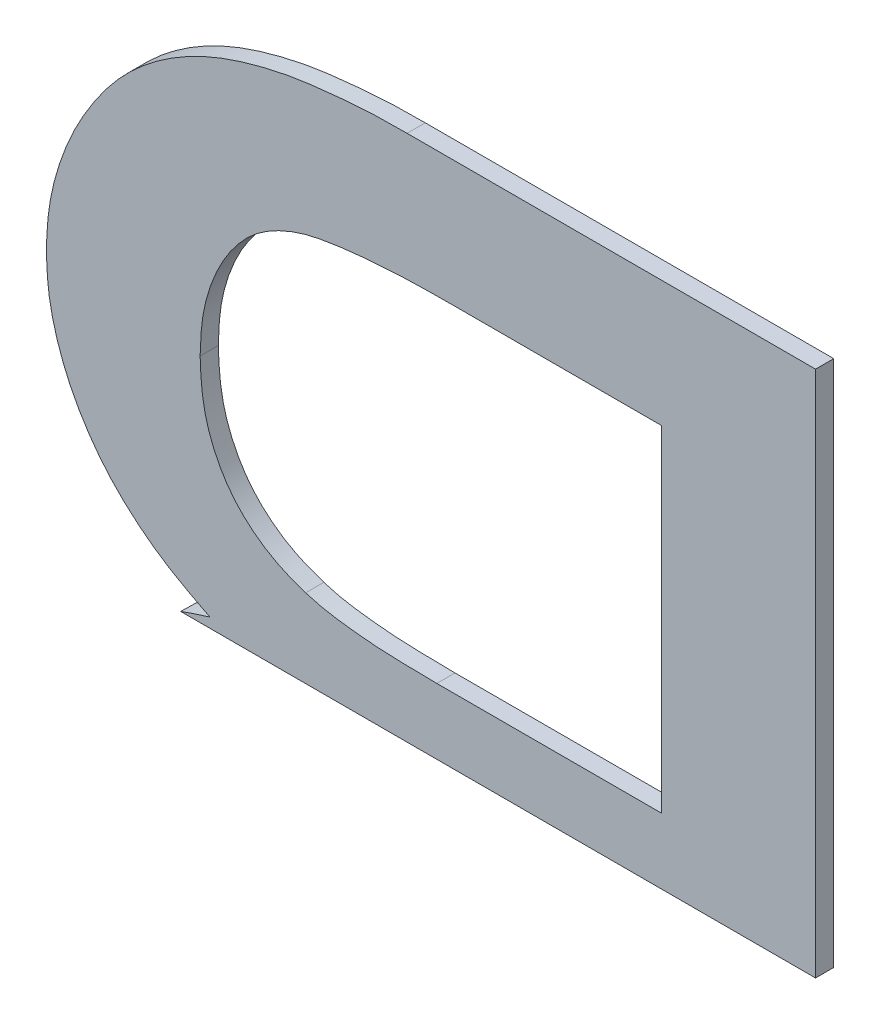
ISO-10303-21;
HEADER;
FILE_DESCRIPTION(('STEP AP214'),'2;1');
FILE_NAME('part.step','',(''),(''),'','','');
FILE_SCHEMA(('AUTOMOTIVE_DESIGN { 1 0 10303 214 1 1 1 1 }'));
ENDSEC;
DATA;
#1=APPLICATION_CONTEXT('core data for automotive mechanical design processes');
#2=APPLICATION_PROTOCOL_DEFINITION('international standard','automotive_design',2000,#1);
#3=PRODUCT_CONTEXT('',#1,'mechanical');
#4=PRODUCT('Part','Part','',(#3));
#5=PRODUCT_RELATED_PRODUCT_CATEGORY('part','',(#4));
#6=PRODUCT_DEFINITION_FORMATION('','',#4);
#7=PRODUCT_DEFINITION_CONTEXT('part definition',#1,'design');
#8=PRODUCT_DEFINITION('design','',#6,#7);
#9=PRODUCT_DEFINITION_SHAPE('','',#8);
#10=(LENGTH_UNIT() NAMED_UNIT(*) SI_UNIT(.MILLI.,.METRE.));
#11=(NAMED_UNIT(*) PLANE_ANGLE_UNIT() SI_UNIT($,.RADIAN.));
#12=(NAMED_UNIT(*) SI_UNIT($,.STERADIAN.) SOLID_ANGLE_UNIT());
#13=UNCERTAINTY_MEASURE_WITH_UNIT(LENGTH_MEASURE(1.E-05),#10,'distance_accuracy_value','');
#14=(GEOMETRIC_REPRESENTATION_CONTEXT(3) GLOBAL_UNCERTAINTY_ASSIGNED_CONTEXT((#13)) GLOBAL_UNIT_ASSIGNED_CONTEXT((#10,
#11,#12)) REPRESENTATION_CONTEXT('',''));
#15=CARTESIAN_POINT('',(0.,0.,0.));
#16=DIRECTION('',(0.,0.,1.));
#17=DIRECTION('',(1.,0.,0.));
#18=AXIS2_PLACEMENT_3D('',#15,#16,#17);
#19=CARTESIAN_POINT('',(10.3846153846154,-15.,0.5));
#20=DIRECTION('',(-1.,0.,0.));
#21=DIRECTION('',(0.,0.,1.));
#22=AXIS2_PLACEMENT_3D('',#19,#20,#21);
#23=PLANE('',#22);
#24=DIRECTION('',(0.,1.,0.));
#25=VECTOR('',#24,1.);
#26=CARTESIAN_POINT('',(10.3846153846154,-15.,0.5));
#27=LINE('',#26,#25);
#28=CARTESIAN_POINT('',(10.3846153846154,0.5,0.5));
#29=VERTEX_POINT('',#28);
#30=CARTESIAN_POINT('',(10.3846153846154,15.,0.5));
#31=VERTEX_POINT('',#30);
#32=EDGE_CURVE('E153',#29,#31,#27,.T.);
#33=ORIENTED_EDGE('',*,*,#32,.F.);
#34=DIRECTION('',(0.,0.,-1.));
#35=VECTOR('',#34,1.);
#36=CARTESIAN_POINT('',(10.3846153846154,0.5,0.5));
#37=LINE('',#36,#35);
#38=CARTESIAN_POINT('',(10.3846153846154,0.5,0.));
#39=VERTEX_POINT('',#38);
#40=EDGE_CURVE('E54',#29,#39,#37,.T.);
#41=ORIENTED_EDGE('',*,*,#40,.T.);
#42=DIRECTION('',(0.,1.,0.));
#43=VECTOR('',#42,1.);
#44=CARTESIAN_POINT('',(10.3846153846154,-15.,0.));
#45=LINE('',#44,#43);
#46=CARTESIAN_POINT('',(10.3846153846154,15.,0.));
#47=VERTEX_POINT('',#46);
#48=EDGE_CURVE('E136',#39,#47,#45,.T.);
#49=ORIENTED_EDGE('',*,*,#48,.T.);
#50=DIRECTION('',(0.,0.,-1.));
#51=VECTOR('',#50,1.);
#52=CARTESIAN_POINT('',(10.3846153846154,15.,0.5));
#53=LINE('',#52,#51);
#54=EDGE_CURVE('E150',#31,#47,#53,.T.);
#55=ORIENTED_EDGE('',*,*,#54,.F.);
#56=EDGE_LOOP('',(#33,#41,#49,#55));
#57=FACE_BOUND('',#56,.T.);
#58=ADVANCED_FACE('F39',(#57),#23,.F.);
#59=CARTESIAN_POINT('',(-6.26802884615383,0.769230769230767,0.5));
#60=CARTESIAN_POINT('',(-6.48935337629664,0.69994669989176,0.5));
#61=CARTESIAN_POINT('',(-6.92266915021833,0.564300280099506,0.5));
#62=CARTESIAN_POINT('',(-7.545605590068,0.316086357587657,0.5));
#63=CARTESIAN_POINT('',(-8.13035265869001,0.0334592836853494,0.5));
#64=CARTESIAN_POINT('',(-8.67818318902735,-0.284045377816053,0.5));
#65=CARTESIAN_POINT('',(-9.18539555947551,-0.639367876477473,0.5));
#66=CARTESIAN_POINT('',(-9.65055860549428,-1.03306214062108,0.5));
#67=CARTESIAN_POINT('',(-10.0768975666602,-1.45903585409812,0.5));
#68=CARTESIAN_POINT('',(-10.4636507466195,-1.91702990224003,0.5));
#69=CARTESIAN_POINT('',(-10.8033728394625,-2.40409699560683,0.5));
#70=CARTESIAN_POINT('',(-11.1080611169842,-2.90959177113516,0.5));
#71=CARTESIAN_POINT('',(-11.359659442595,-3.43960149986684,0.5));
#72=CARTESIAN_POINT('',(-11.5658854279642,-3.99275014392328,0.5));
#73=CARTESIAN_POINT('',(-11.7267723554623,-4.56561972732954,0.5));
#74=CARTESIAN_POINT('',(-11.8423066822912,-5.16041360893499,0.5));
#75=CARTESIAN_POINT('',(-11.9081582988844,-5.77574728947702,0.5));
#76=CARTESIAN_POINT('',(-11.9180490013908,-6.19375599180716,0.5));
#77=CARTESIAN_POINT('',(-11.9230769230769,-6.40625,0.5));
#78=B_SPLINE_CURVE_WITH_KNOTS('',3,(#59,#60,#61,#62,#63,#64,#65,#66,#67,#68,#69,#70,#71,#72,#73,
#74,#75,#76,#77),.UNSPECIFIED.,.F.,.F.,(4,1,1,1,1,1,1,1,1,1,1,1,1,1,1,1,4),(0.,
0.0704642259291747,0.137956965604269,0.203578563614284,0.267691680244943,0.330185864859375,
0.39153376408982,0.452663773487035,0.513153788089214,0.573453553100029,0.632967559389193,
0.692331907420622,0.75147419157163,0.81218744552943,0.872961717848316,0.935420306759491,1.),.UNSPECIFIED.);
#79=DIRECTION('',(0.,0.,-1.));
#80=VECTOR('',#79,1.);
#81=SURFACE_OF_LINEAR_EXTRUSION('',#78,#80);
#82=CARTESIAN_POINT('',(-6.26802884615383,0.769230769230767,0.));
#83=CARTESIAN_POINT('',(-6.48935337629664,0.69994669989176,0.));
#84=CARTESIAN_POINT('',(-6.92266915021833,0.564300280099506,0.));
#85=CARTESIAN_POINT('',(-7.545605590068,0.316086357587657,0.));
#86=CARTESIAN_POINT('',(-8.13035265869001,0.0334592836853494,0.));
#87=CARTESIAN_POINT('',(-8.67818318902735,-0.284045377816053,0.));
#88=CARTESIAN_POINT('',(-9.18539555947551,-0.639367876477473,0.));
#89=CARTESIAN_POINT('',(-9.65055860549428,-1.03306214062108,0.));
#90=CARTESIAN_POINT('',(-10.0768975666602,-1.45903585409812,0.));
#91=CARTESIAN_POINT('',(-10.4636507466195,-1.91702990224003,0.));
#92=CARTESIAN_POINT('',(-10.8033728394625,-2.40409699560683,0.));
#93=CARTESIAN_POINT('',(-11.1080611169842,-2.90959177113516,0.));
#94=CARTESIAN_POINT('',(-11.359659442595,-3.43960149986684,0.));
#95=CARTESIAN_POINT('',(-11.5658854279642,-3.99275014392328,0.));
#96=CARTESIAN_POINT('',(-11.7267723554623,-4.56561972732954,0.));
#97=CARTESIAN_POINT('',(-11.8423066822912,-5.16041360893499,0.));
#98=CARTESIAN_POINT('',(-11.9081582988844,-5.77574728947702,0.));
#99=CARTESIAN_POINT('',(-11.9180490013908,-6.19375599180716,0.));
#100=CARTESIAN_POINT('',(-11.9230769230769,-6.40625,0.));
#101=B_SPLINE_CURVE_WITH_KNOTS('',3,(#82,#83,#84,#85,#86,#87,#88,#89,#90,#91,#92,#93,#94,#95,
#96,#97,#98,#99,#100),.UNSPECIFIED.,.F.,.F.,(4,1,1,1,1,1,1,1,1,1,1,1,1,1,1,1,4),(0.,
0.0704642259291747,0.137956965604269,0.203578563614284,0.267691680244943,0.330185864859375,
0.39153376408982,0.452663773487035,0.513153788089214,0.573453553100029,0.632967559389193,
0.692331907420622,0.75147419157163,0.81218744552943,0.872961717848316,0.935420306759491,1.),.UNSPECIFIED.);
#102=CARTESIAN_POINT('',(-6.26802884615383,0.769230769230767,0.));
#103=VERTEX_POINT('',#102);
#104=CARTESIAN_POINT('',(-7.06231372097856,0.5,-1.2E-05));
#105=VERTEX_POINT('',#104);
#106=EDGE_CURVE('E132',#103,#105,#101,.T.);
#107=ORIENTED_EDGE('',*,*,#106,.T.);
#108=DIRECTION('',(0.,0.,-1.));
#109=VECTOR('',#108,1.);
#110=CARTESIAN_POINT('',(-7.07366778883767,0.500000000000003,0.5));
#111=LINE('',#110,#109);
#112=CARTESIAN_POINT('',(-7.0736678136192,0.5,0.5));
#113=VERTEX_POINT('',#112);
#114=EDGE_CURVE('E125',#105,#113,#111,.F.);
#115=ORIENTED_EDGE('',*,*,#114,.T.);
#116=CARTESIAN_POINT('',(-6.26802884615383,0.769230769230767,0.5));
#117=VERTEX_POINT('',#116);
#118=EDGE_CURVE('E157',#117,#113,#78,.T.);
#119=ORIENTED_EDGE('',*,*,#118,.F.);
#120=DIRECTION('',(0.,0.,-1.));
#121=VECTOR('',#120,1.);
#122=CARTESIAN_POINT('',(-6.26802884615383,0.769230769230767,0.5));
#123=LINE('',#122,#121);
#124=EDGE_CURVE('E128',#117,#103,#123,.T.);
#125=ORIENTED_EDGE('',*,*,#124,.T.);
#126=EDGE_LOOP('',(#107,#115,#119,#125));
#127=FACE_BOUND('',#126,.T.);
#128=ADVANCED_FACE('F143',(#127),#81,.F.);
#129=CARTESIAN_POINT('',(-7.64723066789635,13.3359684193892,0.5));
#130=DIRECTION('',(0.,0.,-1.));
#131=DIRECTION('',(-1.,0.,0.));
#132=AXIS2_PLACEMENT_3D('',#129,#130,#131);
#133=PLANE('',#132);
#134=DIRECTION('',(1.,0.,0.));
#135=VECTOR('',#134,1.);
#136=CARTESIAN_POINT('',(0.438701923076939,11.5384615384615,0.5));
#137=LINE('',#136,#135);
#138=CARTESIAN_POINT('',(0.438701923076939,11.5384615384615,0.5));
#139=VERTEX_POINT('',#138);
#140=CARTESIAN_POINT('',(6.15384615384617,11.5384615384615,0.5));
#141=VERTEX_POINT('',#140);
#142=EDGE_CURVE('E193',#139,#141,#137,.T.);
#143=ORIENTED_EDGE('',*,*,#142,.T.);
#144=DIRECTION('',(0.,-1.,0.));
#145=VECTOR('',#144,1.);
#146=CARTESIAN_POINT('',(6.15384615384617,11.5384615384615,0.5));
#147=LINE('',#146,#145);
#148=CARTESIAN_POINT('',(6.15384615384617,2.30769230769231,0.5));
#149=VERTEX_POINT('',#148);
#150=EDGE_CURVE('E196',#141,#149,#147,.T.);
#151=ORIENTED_EDGE('',*,*,#150,.T.);
#152=DIRECTION('',(-1.,0.,0.));
#153=VECTOR('',#152,1.);
#154=CARTESIAN_POINT('',(6.15384615384617,2.30769230769231,0.5));
#155=LINE('',#154,#153);
#156=CARTESIAN_POINT('',(-0.0300480769230612,2.30769230769231,0.5));
#157=VERTEX_POINT('',#156);
#158=EDGE_CURVE('E256',#149,#157,#155,.T.);
#159=ORIENTED_EDGE('',*,*,#158,.T.);
#160=CARTESIAN_POINT('',(-0.0300480769230612,2.30769230769231,0.5));
#161=CARTESIAN_POINT('',(-0.23240049338027,2.30849289030634,0.5));
#162=CARTESIAN_POINT('',(-0.621165193205609,2.31003099034526,0.5));
#163=CARTESIAN_POINT('',(-1.18194901047781,2.33147669470024,0.5));
#164=CARTESIAN_POINT('',(-1.69952559362627,2.34977295108276,0.5));
#165=CARTESIAN_POINT('',(-2.17189288725188,2.39569514084233,0.5));
#166=CARTESIAN_POINT('',(-2.60139103709894,2.44067388574795,0.5));
#167=CARTESIAN_POINT('',(-2.98630124368729,2.50122228773484,0.5));
#168=CARTESIAN_POINT('',(-3.32850881835905,2.56944660369593,0.5));
#169=CARTESIAN_POINT('',(-3.53804257435428,2.63272978531761,0.5));
#170=CARTESIAN_POINT('',(-3.63581730769229,2.66225961538461,0.5));
#171=B_SPLINE_CURVE_WITH_KNOTS('',3,(#160,#161,#162,#163,#164,#165,#166,#167,#168,#169,#170),
.UNSPECIFIED.,.F.,.F.,(4,1,1,1,1,1,1,1,4),(0.,0.16698017440603,0.320806632884816,
0.463134504870316,0.59424805397852,0.712367152539743,0.81945495104275,0.915752266581353,1.),.UNSPECIFIED.);
#172=CARTESIAN_POINT('',(-3.63581730769229,2.66225961538461,0.5));
#173=VERTEX_POINT('',#172);
#174=EDGE_CURVE('E253',#157,#173,#171,.T.);
#175=ORIENTED_EDGE('',*,*,#174,.T.);
#176=CARTESIAN_POINT('',(-3.63581730769229,2.66225961538461,0.5));
#177=CARTESIAN_POINT('',(-3.86555286662356,2.74273599967502,0.5));
#178=CARTESIAN_POINT('',(-4.30843494860494,2.89787762768712,0.5));
#179=CARTESIAN_POINT('',(-4.90193836529667,3.25021986193585,0.5));
#180=CARTESIAN_POINT('',(-5.40743076561366,3.6730288234378,0.5));
#181=CARTESIAN_POINT('',(-5.8235575407756,4.17377027808865,0.5));
#182=CARTESIAN_POINT('',(-6.14333034805913,4.74976446625595,0.5));
#183=CARTESIAN_POINT('',(-6.38043265423418,5.38906666736939,0.5));
#184=CARTESIAN_POINT('',(-6.51025142776296,6.10061373439338,0.5));
#185=CARTESIAN_POINT('',(-6.52880255348966,6.5940466244931,0.5));
#186=CARTESIAN_POINT('',(-6.53846153846152,6.85096153846154,0.5));
#187=B_SPLINE_CURVE_WITH_KNOTS('',3,(#176,#177,#178,#179,#180,#181,#182,#183,#184,#185,#186),
.UNSPECIFIED.,.F.,.F.,(4,1,1,1,1,1,1,1,4),(0.,0.132376878438656,0.255194919767069,
0.373722141653669,0.490011315447417,0.607812421423935,0.731109815901543,0.859997377757584,1.),.UNSPECIFIED.);
#188=CARTESIAN_POINT('',(-6.53846153846152,6.85096153846154,0.5));
#189=VERTEX_POINT('',#188);
#190=EDGE_CURVE('E260',#173,#189,#187,.T.);
#191=ORIENTED_EDGE('',*,*,#190,.T.);
#192=CARTESIAN_POINT('',(-6.53846153846152,6.85096153846154,0.5));
#193=CARTESIAN_POINT('',(-6.53069506057908,7.09787339361039,0.5));
#194=CARTESIAN_POINT('',(-6.5155590908324,7.57907612491225,0.5));
#195=CARTESIAN_POINT('',(-6.38850615787315,8.27786592163912,0.5));
#196=CARTESIAN_POINT('',(-6.1686457510012,8.92796150999,0.5));
#197=CARTESIAN_POINT('',(-5.87089455312206,9.52922028218994,0.5));
#198=CARTESIAN_POINT('',(-5.49386242313279,10.0641263167252,0.5));
#199=CARTESIAN_POINT('',(-5.04386142403118,10.5240202975129,0.5));
#200=CARTESIAN_POINT('',(-4.50479199033176,10.8716798988444,0.5));
#201=CARTESIAN_POINT('',(-4.00092354102481,11.0885506745381,0.5));
#202=CARTESIAN_POINT('',(-3.54773380419076,11.2242238065465,0.5));
#203=CARTESIAN_POINT('',(-3.14282469068651,11.3044960140471,0.5));
#204=CARTESIAN_POINT('',(-2.68353698672918,11.375223811948,0.5));
#205=CARTESIAN_POINT('',(-2.16835930209676,11.435354233946,0.5));
#206=CARTESIAN_POINT('',(-1.59709675970205,11.4820209815339,0.5));
#207=CARTESIAN_POINT('',(-0.967989200049305,11.5190946198919,0.5));
#208=CARTESIAN_POINT('',(-0.282534172116397,11.5348351866858,0.5));
#209=CARTESIAN_POINT('',(0.192304023735327,11.5372226577874,0.5));
#210=CARTESIAN_POINT('',(0.438701923076939,11.5384615384615,0.5));
#211=B_SPLINE_CURVE_WITH_KNOTS('',3,(#192,#193,#194,#195,#196,#197,#198,#199,#200,#201,#202,
#203,#204,#205,#206,#207,#208,#209,#210),.UNSPECIFIED.,.F.,.F.,(4,1,1,1,1,1,1,1,1,1,1,1,1,1,1,1,
4),(0.,0.076010519206233,0.148135736243448,0.217788177833154,0.286767898497234,
0.354043463243919,0.418610840023479,0.483636438855344,0.550229562646152,0.586927811313815,
0.629157825026966,0.67723822428767,0.73004263974373,0.788862566116924,0.853750451461094,
0.924109766538456,1.),.UNSPECIFIED.);
#212=EDGE_CURVE('E163',#189,#139,#211,.T.);
#213=ORIENTED_EDGE('',*,*,#212,.T.);
#214=EDGE_LOOP('',(#143,#151,#159,#175,#191,#213));
#215=FACE_BOUND('',#214,.T.);
#216=ORIENTED_EDGE('',*,*,#118,.T.);
#217=DIRECTION('',(1.,0.,0.));
#218=VECTOR('',#217,1.);
#219=CARTESIAN_POINT('',(-7.64723066789635,0.5,0.5));
#220=LINE('',#219,#218);
#221=EDGE_CURVE('E123',#113,#29,#220,.T.);
#222=ORIENTED_EDGE('',*,*,#221,.T.);
#223=ORIENTED_EDGE('',*,*,#32,.T.);
#224=DIRECTION('',(-1.,0.,0.));
#225=VECTOR('',#224,1.);
#226=CARTESIAN_POINT('',(10.3846153846154,15.,0.5));
#227=LINE('',#226,#225);
#228=CARTESIAN_POINT('',(-0.847355769230753,15.,0.5));
#229=VERTEX_POINT('',#228);
#230=EDGE_CURVE('E158',#31,#229,#227,.T.);
#231=ORIENTED_EDGE('',*,*,#230,.T.);
#232=CARTESIAN_POINT('',(-0.847355769230753,15.,0.5));
#233=CARTESIAN_POINT('',(-1.12589007722253,14.9989314752155,0.5));
#234=CARTESIAN_POINT('',(-1.66938969441517,14.9968464795985,0.5));
#235=CARTESIAN_POINT('',(-2.46301152136422,14.9447028980814,0.5));
#236=CARTESIAN_POINT('',(-3.21463065350947,14.873381292372,0.5));
#237=CARTESIAN_POINT('',(-3.92586515239419,14.781445555412,0.5));
#238=CARTESIAN_POINT('',(-4.59363751395842,14.6480486679803,0.5));
#239=CARTESIAN_POINT('',(-5.21732545030288,14.4864472560523,0.5));
#240=CARTESIAN_POINT('',(-5.80017461963034,14.3000452483374,0.5));
#241=CARTESIAN_POINT('',(-6.51261891112197,14.0160946139127,0.5));
#242=CARTESIAN_POINT('',(-7.33363284840564,13.5790342304112,0.5));
#243=CARTESIAN_POINT('',(-8.213016771161,12.9268711716636,0.5));
#244=CARTESIAN_POINT('',(-8.97811495024224,12.1438572758884,0.5));
#245=CARTESIAN_POINT('',(-9.60767823585407,11.2460875058578,0.5));
#246=CARTESIAN_POINT('',(-10.1263704838963,10.2871000752008,0.5));
#247=CARTESIAN_POINT('',(-10.4941172154874,9.28516460502699,0.5));
#248=CARTESIAN_POINT('',(-10.729237619079,8.26209567201785,0.5));
#249=CARTESIAN_POINT('',(-10.7559147738829,7.56934607991821,0.5));
#250=CARTESIAN_POINT('',(-10.7692307692308,7.22355769230769,0.5));
#251=B_SPLINE_CURVE_WITH_KNOTS('',3,(#232,#233,#234,#235,#236,#237,#238,#239,#240,#241,#242,
#243,#244,#245,#246,#247,#248,#249,#250),.UNSPECIFIED.,.F.,.F.,(4,1,1,1,1,1,1,1,1,1,1,1,1,1,1,1,
4),(0.,0.058732037100865,0.114602900846982,0.167656810044612,0.217966707090843,
0.265775205629375,0.311170651053696,0.353791804664669,0.394744908000307,0.472805951082463,
0.549192366561607,0.624780107579555,0.702624764024225,0.779741432194039,0.854063463988625,
0.92715526641035,1.),.UNSPECIFIED.);
#252=CARTESIAN_POINT('',(-10.7692307692308,7.22355769230769,0.5));
#253=VERTEX_POINT('',#252);
#254=EDGE_CURVE('E190',#229,#253,#251,.T.);
#255=ORIENTED_EDGE('',*,*,#254,.T.);
#256=CARTESIAN_POINT('',(-10.7692307692308,7.22355769230769,0.5));
#257=CARTESIAN_POINT('',(-10.7552328466198,6.90184849717268,0.5));
#258=CARTESIAN_POINT('',(-10.7273719545648,6.26153168675473,0.5));
#259=CARTESIAN_POINT('',(-10.5056304250575,5.31830607944326,0.5));
#260=CARTESIAN_POINT('',(-10.1556544518576,4.40243988773038,0.5));
#261=CARTESIAN_POINT('',(-9.66077851773958,3.5250672868075,0.5));
#262=CARTESIAN_POINT('',(-9.02826504301689,2.7022396088597,0.5));
#263=CARTESIAN_POINT('',(-8.24412895692989,1.9617966628179,0.5));
#264=CARTESIAN_POINT('',(-7.31963822370564,1.30215159484845,0.5));
#265=CARTESIAN_POINT('',(-6.6258079591552,0.950541381668758,0.5));
#266=CARTESIAN_POINT('',(-6.26802884615383,0.769230769230767,0.5));
#267=B_SPLINE_CURVE_WITH_KNOTS('',3,(#256,#257,#258,#259,#260,#261,#262,#263,#264,#265,#266),
.UNSPECIFIED.,.F.,.F.,(4,1,1,1,1,1,1,1,4),(0.,0.115842690601018,0.230568548482884,
0.347354604520545,0.468252746734462,0.592302571480084,0.719970165620697,0.85560038113491,1.),.UNSPECIFIED.);
#268=EDGE_CURVE('E183',#253,#117,#267,.T.);
#269=ORIENTED_EDGE('',*,*,#268,.T.);
#270=EDGE_LOOP('',(#216,#222,#223,#231,#255,#269));
#271=FACE_BOUND('',#270,.T.);
#272=ADVANCED_FACE('F172',(#215,#271),#133,.F.);
#273=CARTESIAN_POINT('',(10.3846153846154,15.,0.5));
#274=DIRECTION('',(0.,-1.,0.));
#275=DIRECTION('',(0.,0.,-1.));
#276=AXIS2_PLACEMENT_3D('',#273,#274,#275);
#277=PLANE('',#276);
#278=DIRECTION('',(-1.,0.,0.));
#279=VECTOR('',#278,1.);
#280=CARTESIAN_POINT('',(10.3846153846154,15.,0.));
#281=LINE('',#280,#279);
#282=CARTESIAN_POINT('',(-0.847355769230753,15.,0.));
#283=VERTEX_POINT('',#282);
#284=EDGE_CURVE('E192',#47,#283,#281,.T.);
#285=ORIENTED_EDGE('',*,*,#284,.T.);
#286=DIRECTION('',(0.,0.,-1.));
#287=VECTOR('',#286,1.);
#288=CARTESIAN_POINT('',(-0.847355769230753,15.,0.5));
#289=LINE('',#288,#287);
#290=EDGE_CURVE('E206',#229,#283,#289,.T.);
#291=ORIENTED_EDGE('',*,*,#290,.F.);
#292=ORIENTED_EDGE('',*,*,#230,.F.);
#293=ORIENTED_EDGE('',*,*,#54,.T.);
#294=EDGE_LOOP('',(#285,#291,#292,#293));
#295=FACE_BOUND('',#294,.T.);
#296=ADVANCED_FACE('F443',(#295),#277,.F.);
#297=DIRECTION('',(0.,0.,-1.));
#298=VECTOR('',#297,1.);
#299=SURFACE_OF_LINEAR_EXTRUSION('',#251,#298);
#300=CARTESIAN_POINT('',(-0.847355769230753,15.,0.));
#301=CARTESIAN_POINT('',(-1.12589007722253,14.9989314752155,0.));
#302=CARTESIAN_POINT('',(-1.66938969441517,14.9968464795985,0.));
#303=CARTESIAN_POINT('',(-2.46301152136422,14.9447028980814,0.));
#304=CARTESIAN_POINT('',(-3.21463065350947,14.873381292372,0.));
#305=CARTESIAN_POINT('',(-3.92586515239419,14.781445555412,0.));
#306=CARTESIAN_POINT('',(-4.59363751395842,14.6480486679803,0.));
#307=CARTESIAN_POINT('',(-5.21732545030288,14.4864472560523,0.));
#308=CARTESIAN_POINT('',(-5.80017461963034,14.3000452483374,0.));
#309=CARTESIAN_POINT('',(-6.51261891112197,14.0160946139127,0.));
#310=CARTESIAN_POINT('',(-7.33363284840564,13.5790342304112,0.));
#311=CARTESIAN_POINT('',(-8.213016771161,12.9268711716636,0.));
#312=CARTESIAN_POINT('',(-8.97811495024224,12.1438572758884,0.));
#313=CARTESIAN_POINT('',(-9.60767823585407,11.2460875058578,0.));
#314=CARTESIAN_POINT('',(-10.1263704838963,10.2871000752008,0.));
#315=CARTESIAN_POINT('',(-10.4941172154874,9.28516460502699,0.));
#316=CARTESIAN_POINT('',(-10.729237619079,8.26209567201785,0.));
#317=CARTESIAN_POINT('',(-10.7559147738829,7.56934607991821,0.));
#318=CARTESIAN_POINT('',(-10.7692307692308,7.22355769230769,0.));
#319=B_SPLINE_CURVE_WITH_KNOTS('',3,(#300,#301,#302,#303,#304,#305,#306,#307,#308,#309,#310,
#311,#312,#313,#314,#315,#316,#317,#318),.UNSPECIFIED.,.F.,.F.,(4,1,1,1,1,1,1,1,1,1,1,1,1,1,1,1,
4),(0.,0.058732037100865,0.114602900846982,0.167656810044612,0.217966707090843,
0.265775205629375,0.311170651053696,0.353791804664669,0.394744908000307,0.472805951082463,
0.549192366561607,0.624780107579555,0.702624764024225,0.779741432194039,0.854063463988625,
0.92715526641035,1.),.UNSPECIFIED.);
#320=CARTESIAN_POINT('',(-10.7692307692308,7.22355769230769,0.));
#321=VERTEX_POINT('',#320);
#322=EDGE_CURVE('E210',#283,#321,#319,.T.);
#323=ORIENTED_EDGE('',*,*,#322,.T.);
#324=DIRECTION('',(0.,0.,-1.));
#325=VECTOR('',#324,1.);
#326=CARTESIAN_POINT('',(-10.7692307692308,7.22355769230769,0.5));
#327=LINE('',#326,#325);
#328=EDGE_CURVE('E205',#253,#321,#327,.T.);
#329=ORIENTED_EDGE('',*,*,#328,.F.);
#330=ORIENTED_EDGE('',*,*,#254,.F.);
#331=ORIENTED_EDGE('',*,*,#290,.T.);
#332=EDGE_LOOP('',(#323,#329,#330,#331));
#333=FACE_BOUND('',#332,.T.);
#334=ADVANCED_FACE('F235',(#333),#299,.F.);
#335=DIRECTION('',(0.,0.,-1.));
#336=VECTOR('',#335,1.);
#337=SURFACE_OF_LINEAR_EXTRUSION('',#267,#336);
#338=CARTESIAN_POINT('',(-10.7692307692308,7.22355769230769,0.));
#339=CARTESIAN_POINT('',(-10.7552328466198,6.90184849717268,0.));
#340=CARTESIAN_POINT('',(-10.7273719545648,6.26153168675473,0.));
#341=CARTESIAN_POINT('',(-10.5056304250575,5.31830607944326,0.));
#342=CARTESIAN_POINT('',(-10.1556544518576,4.40243988773038,0.));
#343=CARTESIAN_POINT('',(-9.66077851773958,3.5250672868075,0.));
#344=CARTESIAN_POINT('',(-9.02826504301689,2.7022396088597,0.));
#345=CARTESIAN_POINT('',(-8.24412895692989,1.9617966628179,0.));
#346=CARTESIAN_POINT('',(-7.31963822370564,1.30215159484845,0.));
#347=CARTESIAN_POINT('',(-6.6258079591552,0.950541381668758,0.));
#348=CARTESIAN_POINT('',(-6.26802884615383,0.769230769230767,0.));
#349=B_SPLINE_CURVE_WITH_KNOTS('',3,(#338,#339,#340,#341,#342,#343,#344,#345,#346,#347,#348),
.UNSPECIFIED.,.F.,.F.,(4,1,1,1,1,1,1,1,4),(0.,0.115842690601018,0.230568548482884,
0.347354604520545,0.468252746734462,0.592302571480084,0.719970165620697,0.85560038113491,1.),.UNSPECIFIED.);
#350=EDGE_CURVE('E191',#321,#103,#349,.T.);
#351=ORIENTED_EDGE('',*,*,#350,.T.);
#352=ORIENTED_EDGE('',*,*,#124,.F.);
#353=ORIENTED_EDGE('',*,*,#268,.F.);
#354=ORIENTED_EDGE('',*,*,#328,.T.);
#355=EDGE_LOOP('',(#351,#352,#353,#354));
#356=FACE_BOUND('',#355,.T.);
#357=ADVANCED_FACE('F194',(#356),#337,.F.);
#358=CARTESIAN_POINT('',(-7.64723066789635,13.3359684193892,0.));
#359=DIRECTION('',(0.,0.,-1.));
#360=DIRECTION('',(-1.,0.,0.));
#361=AXIS2_PLACEMENT_3D('',#358,#359,#360);
#362=PLANE('',#361);
#363=DIRECTION('',(1.,0.,0.));
#364=VECTOR('',#363,1.);
#365=CARTESIAN_POINT('',(-7.64723066789635,0.5,0.));
#366=LINE('',#365,#364);
#367=EDGE_CURVE('E11',#105,#39,#366,.T.);
#368=ORIENTED_EDGE('',*,*,#367,.F.);
#369=ORIENTED_EDGE('',*,*,#106,.F.);
#370=ORIENTED_EDGE('',*,*,#350,.F.);
#371=ORIENTED_EDGE('',*,*,#322,.F.);
#372=ORIENTED_EDGE('',*,*,#284,.F.);
#373=ORIENTED_EDGE('',*,*,#48,.F.);
#374=EDGE_LOOP('',(#368,#369,#370,#371,#372,#373));
#375=FACE_BOUND('',#374,.T.);
#376=DIRECTION('',(0.,-1.,0.));
#377=VECTOR('',#376,1.);
#378=CARTESIAN_POINT('',(6.15384615384617,11.5384615384615,0.));
#379=LINE('',#378,#377);
#380=CARTESIAN_POINT('',(6.15384615384617,11.5384615384615,0.));
#381=VERTEX_POINT('',#380);
#382=CARTESIAN_POINT('',(6.15384615384617,2.30769230769231,0.));
#383=VERTEX_POINT('',#382);
#384=EDGE_CURVE('E282',#381,#383,#379,.T.);
#385=ORIENTED_EDGE('',*,*,#384,.F.);
#386=DIRECTION('',(1.,0.,0.));
#387=VECTOR('',#386,1.);
#388=CARTESIAN_POINT('',(0.438701923076939,11.5384615384615,0.));
#389=LINE('',#388,#387);
#390=CARTESIAN_POINT('',(0.438701923076939,11.5384615384615,0.));
#391=VERTEX_POINT('',#390);
#392=EDGE_CURVE('E304',#391,#381,#389,.T.);
#393=ORIENTED_EDGE('',*,*,#392,.F.);
#394=CARTESIAN_POINT('',(-6.53846153846152,6.85096153846154,0.));
#395=CARTESIAN_POINT('',(-6.53069506057908,7.09787339361039,0.));
#396=CARTESIAN_POINT('',(-6.5155590908324,7.57907612491225,0.));
#397=CARTESIAN_POINT('',(-6.38850615787315,8.27786592163912,0.));
#398=CARTESIAN_POINT('',(-6.1686457510012,8.92796150999,0.));
#399=CARTESIAN_POINT('',(-5.87089455312206,9.52922028218994,0.));
#400=CARTESIAN_POINT('',(-5.49386242313279,10.0641263167252,0.));
#401=CARTESIAN_POINT('',(-5.04386142403118,10.5240202975129,0.));
#402=CARTESIAN_POINT('',(-4.50479199033176,10.8716798988444,0.));
#403=CARTESIAN_POINT('',(-4.00092354102481,11.0885506745381,0.));
#404=CARTESIAN_POINT('',(-3.54773380419076,11.2242238065465,0.));
#405=CARTESIAN_POINT('',(-3.14282469068651,11.3044960140471,0.));
#406=CARTESIAN_POINT('',(-2.68353698672918,11.375223811948,0.));
#407=CARTESIAN_POINT('',(-2.16835930209676,11.435354233946,0.));
#408=CARTESIAN_POINT('',(-1.59709675970205,11.4820209815339,0.));
#409=CARTESIAN_POINT('',(-0.967989200049305,11.5190946198919,0.));
#410=CARTESIAN_POINT('',(-0.282534172116397,11.5348351866858,0.));
#411=CARTESIAN_POINT('',(0.192304023735327,11.5372226577874,0.));
#412=CARTESIAN_POINT('',(0.438701923076939,11.5384615384615,0.));
#413=B_SPLINE_CURVE_WITH_KNOTS('',3,(#394,#395,#396,#397,#398,#399,#400,#401,#402,#403,#404,
#405,#406,#407,#408,#409,#410,#411,#412),.UNSPECIFIED.,.F.,.F.,(4,1,1,1,1,1,1,1,1,1,1,1,1,1,1,1,
4),(0.,0.076010519206233,0.148135736243448,0.217788177833154,0.286767898497234,
0.354043463243919,0.418610840023479,0.483636438855344,0.550229562646152,0.586927811313815,
0.629157825026966,0.67723822428767,0.73004263974373,0.788862566116924,0.853750451461094,
0.924109766538456,1.),.UNSPECIFIED.);
#414=CARTESIAN_POINT('',(-6.53846153846152,6.85096153846154,0.));
#415=VERTEX_POINT('',#414);
#416=EDGE_CURVE('E298',#415,#391,#413,.T.);
#417=ORIENTED_EDGE('',*,*,#416,.F.);
#418=CARTESIAN_POINT('',(-3.63581730769229,2.66225961538461,0.));
#419=CARTESIAN_POINT('',(-3.86555286662356,2.74273599967502,0.));
#420=CARTESIAN_POINT('',(-4.30843494860494,2.89787762768712,0.));
#421=CARTESIAN_POINT('',(-4.90193836529667,3.25021986193585,0.));
#422=CARTESIAN_POINT('',(-5.40743076561366,3.6730288234378,0.));
#423=CARTESIAN_POINT('',(-5.8235575407756,4.17377027808865,0.));
#424=CARTESIAN_POINT('',(-6.14333034805913,4.74976446625595,0.));
#425=CARTESIAN_POINT('',(-6.38043265423418,5.38906666736939,0.));
#426=CARTESIAN_POINT('',(-6.51025142776296,6.10061373439338,0.));
#427=CARTESIAN_POINT('',(-6.52880255348966,6.5940466244931,0.));
#428=CARTESIAN_POINT('',(-6.53846153846152,6.85096153846154,0.));
#429=B_SPLINE_CURVE_WITH_KNOTS('',3,(#418,#419,#420,#421,#422,#423,#424,#425,#426,#427,#428),
.UNSPECIFIED.,.F.,.F.,(4,1,1,1,1,1,1,1,4),(0.,0.132376878438656,0.255194919767069,
0.373722141653669,0.490011315447417,0.607812421423935,0.731109815901543,0.859997377757584,1.),.UNSPECIFIED.);
#430=CARTESIAN_POINT('',(-3.63581730769229,2.66225961538461,0.));
#431=VERTEX_POINT('',#430);
#432=EDGE_CURVE('E300',#431,#415,#429,.T.);
#433=ORIENTED_EDGE('',*,*,#432,.F.);
#434=CARTESIAN_POINT('',(-0.0300480769230612,2.30769230769231,0.));
#435=CARTESIAN_POINT('',(-0.23240049338027,2.30849289030634,0.));
#436=CARTESIAN_POINT('',(-0.621165193205609,2.31003099034526,0.));
#437=CARTESIAN_POINT('',(-1.18194901047781,2.33147669470024,0.));
#438=CARTESIAN_POINT('',(-1.69952559362627,2.34977295108276,0.));
#439=CARTESIAN_POINT('',(-2.17189288725188,2.39569514084233,0.));
#440=CARTESIAN_POINT('',(-2.60139103709894,2.44067388574795,0.));
#441=CARTESIAN_POINT('',(-2.98630124368729,2.50122228773484,0.));
#442=CARTESIAN_POINT('',(-3.32850881835905,2.56944660369593,0.));
#443=CARTESIAN_POINT('',(-3.53804257435428,2.63272978531761,0.));
#444=CARTESIAN_POINT('',(-3.63581730769229,2.66225961538461,0.));
#445=B_SPLINE_CURVE_WITH_KNOTS('',3,(#434,#435,#436,#437,#438,#439,#440,#441,#442,#443,#444),
.UNSPECIFIED.,.F.,.F.,(4,1,1,1,1,1,1,1,4),(0.,0.16698017440603,0.320806632884816,
0.463134504870316,0.59424805397852,0.712367152539743,0.81945495104275,0.915752266581353,1.),.UNSPECIFIED.);
#446=CARTESIAN_POINT('',(-0.0300480769230612,2.30769230769231,0.));
#447=VERTEX_POINT('',#446);
#448=EDGE_CURVE('E288',#447,#431,#445,.T.);
#449=ORIENTED_EDGE('',*,*,#448,.F.);
#450=DIRECTION('',(-1.,0.,0.));
#451=VECTOR('',#450,1.);
#452=CARTESIAN_POINT('',(6.15384615384617,2.30769230769231,0.));
#453=LINE('',#452,#451);
#454=EDGE_CURVE('E281',#383,#447,#453,.T.);
#455=ORIENTED_EDGE('',*,*,#454,.F.);
#456=EDGE_LOOP('',(#385,#393,#417,#433,#449,#455));
#457=FACE_BOUND('',#456,.T.);
#458=ADVANCED_FACE('F41',(#375,#457),#362,.T.);
#459=CARTESIAN_POINT('',(6.15384615384617,11.5384615384615,0.5));
#460=DIRECTION('',(1.,0.,0.));
#461=DIRECTION('',(0.,0.,-1.));
#462=AXIS2_PLACEMENT_3D('',#459,#460,#461);
#463=PLANE('',#462);
#464=ORIENTED_EDGE('',*,*,#384,.T.);
#465=DIRECTION('',(0.,0.,-1.));
#466=VECTOR('',#465,1.);
#467=CARTESIAN_POINT('',(6.15384615384617,2.30769230769231,0.5));
#468=LINE('',#467,#466);
#469=EDGE_CURVE('E47',#149,#383,#468,.T.);
#470=ORIENTED_EDGE('',*,*,#469,.F.);
#471=ORIENTED_EDGE('',*,*,#150,.F.);
#472=DIRECTION('',(0.,0.,-1.));
#473=VECTOR('',#472,1.);
#474=CARTESIAN_POINT('',(6.15384615384617,11.5384615384615,0.5));
#475=LINE('',#474,#473);
#476=EDGE_CURVE('E280',#141,#381,#475,.T.);
#477=ORIENTED_EDGE('',*,*,#476,.T.);
#478=EDGE_LOOP('',(#464,#470,#471,#477));
#479=FACE_BOUND('',#478,.T.);
#480=ADVANCED_FACE('F231',(#479),#463,.F.);
#481=CARTESIAN_POINT('',(0.438701923076939,11.5384615384615,0.5));
#482=DIRECTION('',(0.,1.,0.));
#483=DIRECTION('',(0.,0.,1.));
#484=AXIS2_PLACEMENT_3D('',#481,#482,#483);
#485=PLANE('',#484);
#486=ORIENTED_EDGE('',*,*,#392,.T.);
#487=ORIENTED_EDGE('',*,*,#476,.F.);
#488=ORIENTED_EDGE('',*,*,#142,.F.);
#489=DIRECTION('',(0.,0.,-1.));
#490=VECTOR('',#489,1.);
#491=CARTESIAN_POINT('',(0.438701923076939,11.5384615384615,0.5));
#492=LINE('',#491,#490);
#493=EDGE_CURVE('E302',#139,#391,#492,.T.);
#494=ORIENTED_EDGE('',*,*,#493,.T.);
#495=EDGE_LOOP('',(#486,#487,#488,#494));
#496=FACE_BOUND('',#495,.T.);
#497=ADVANCED_FACE('F240',(#496),#485,.F.);
#498=DIRECTION('',(0.,0.,-1.));
#499=VECTOR('',#498,1.);
#500=SURFACE_OF_LINEAR_EXTRUSION('',#211,#499);
#501=ORIENTED_EDGE('',*,*,#416,.T.);
#502=ORIENTED_EDGE('',*,*,#493,.F.);
#503=ORIENTED_EDGE('',*,*,#212,.F.);
#504=DIRECTION('',(0.,0.,-1.));
#505=VECTOR('',#504,1.);
#506=CARTESIAN_POINT('',(-6.53846153846152,6.85096153846154,0.5));
#507=LINE('',#506,#505);
#508=EDGE_CURVE('E299',#189,#415,#507,.T.);
#509=ORIENTED_EDGE('',*,*,#508,.T.);
#510=EDGE_LOOP('',(#501,#502,#503,#509));
#511=FACE_BOUND('',#510,.T.);
#512=ADVANCED_FACE('F332',(#511),#500,.F.);
#513=DIRECTION('',(0.,0.,-1.));
#514=VECTOR('',#513,1.);
#515=SURFACE_OF_LINEAR_EXTRUSION('',#187,#514);
#516=ORIENTED_EDGE('',*,*,#432,.T.);
#517=ORIENTED_EDGE('',*,*,#508,.F.);
#518=ORIENTED_EDGE('',*,*,#190,.F.);
#519=DIRECTION('',(0.,0.,-1.));
#520=VECTOR('',#519,1.);
#521=CARTESIAN_POINT('',(-3.63581730769229,2.66225961538461,0.5));
#522=LINE('',#521,#520);
#523=EDGE_CURVE('E291',#173,#431,#522,.T.);
#524=ORIENTED_EDGE('',*,*,#523,.T.);
#525=EDGE_LOOP('',(#516,#517,#518,#524));
#526=FACE_BOUND('',#525,.T.);
#527=ADVANCED_FACE('F250',(#526),#515,.F.);
#528=DIRECTION('',(0.,0.,-1.));
#529=VECTOR('',#528,1.);
#530=SURFACE_OF_LINEAR_EXTRUSION('',#171,#529);
#531=ORIENTED_EDGE('',*,*,#448,.T.);
#532=ORIENTED_EDGE('',*,*,#523,.F.);
#533=ORIENTED_EDGE('',*,*,#174,.F.);
#534=DIRECTION('',(0.,0.,-1.));
#535=VECTOR('',#534,1.);
#536=CARTESIAN_POINT('',(-0.0300480769230612,2.30769230769231,0.5));
#537=LINE('',#536,#535);
#538=EDGE_CURVE('E290',#157,#447,#537,.T.);
#539=ORIENTED_EDGE('',*,*,#538,.T.);
#540=EDGE_LOOP('',(#531,#532,#533,#539));
#541=FACE_BOUND('',#540,.T.);
#542=ADVANCED_FACE('F245',(#541),#530,.F.);
#543=CARTESIAN_POINT('',(6.15384615384617,2.30769230769231,0.5));
#544=DIRECTION('',(0.,-1.,0.));
#545=DIRECTION('',(0.,0.,-1.));
#546=AXIS2_PLACEMENT_3D('',#543,#544,#545);
#547=PLANE('',#546);
#548=ORIENTED_EDGE('',*,*,#454,.T.);
#549=ORIENTED_EDGE('',*,*,#538,.F.);
#550=ORIENTED_EDGE('',*,*,#158,.F.);
#551=ORIENTED_EDGE('',*,*,#469,.T.);
#552=EDGE_LOOP('',(#548,#549,#550,#551));
#553=FACE_BOUND('',#552,.T.);
#554=ADVANCED_FACE('F239',(#553),#547,.F.);
#555=CARTESIAN_POINT('',(-17.,0.5,1.));
#556=DIRECTION('',(0.,1.,0.));
#557=DIRECTION('',(0.,0.,1.));
#558=AXIS2_PLACEMENT_3D('',#555,#556,#557);
#559=PLANE('',#558);
#560=ORIENTED_EDGE('',*,*,#221,.F.);
#561=ORIENTED_EDGE('',*,*,#114,.F.);
#562=ORIENTED_EDGE('',*,*,#367,.T.);
#563=ORIENTED_EDGE('',*,*,#40,.F.);
#564=EDGE_LOOP('',(#560,#561,#562,#563));
#565=FACE_BOUND('',#564,.T.);
#566=ADVANCED_FACE('F121',(#565),#559,.F.);
#567=CLOSED_SHELL('',(#58,#128,#272,#296,#334,#357,#458,#480,#497,#512,#527,#542,#554,#566));
#568=MANIFOLD_SOLID_BREP('B2',#567);
#569=ADVANCED_BREP_SHAPE_REPRESENTATION('',(#18,#568),#14);
#570=SHAPE_DEFINITION_REPRESENTATION(#9,#569);
ENDSEC;
END-ISO-10303-21;
